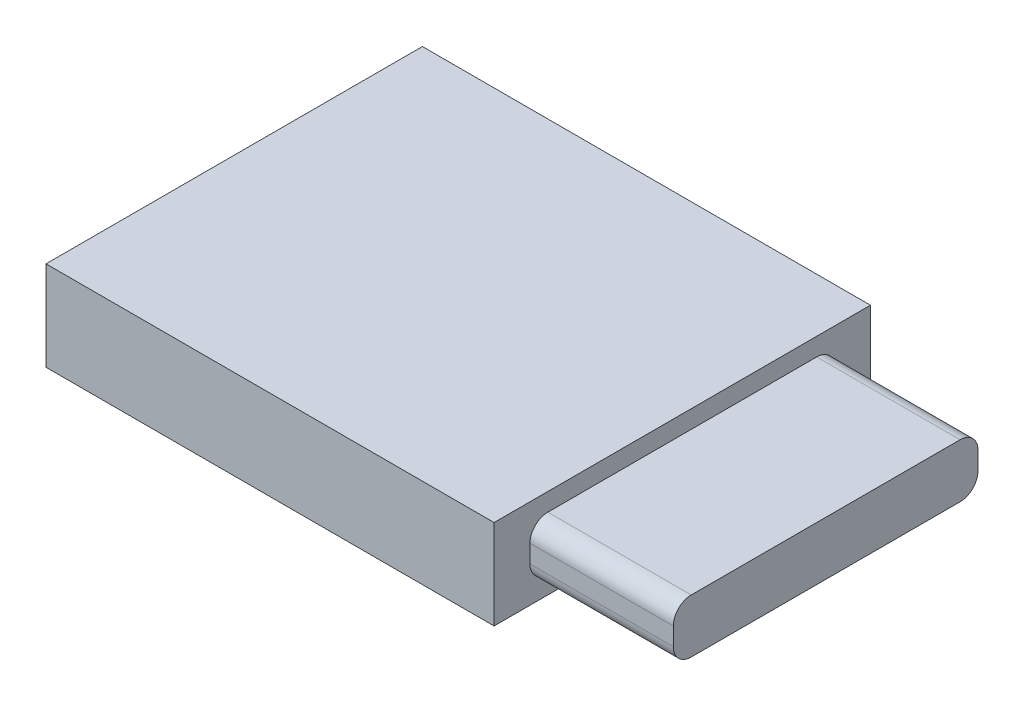
ISO-10303-21;
HEADER;
FILE_DESCRIPTION(('STEP AP214'),'2;1');
FILE_NAME('part.step','',(''),(''),'','','');
FILE_SCHEMA(('AUTOMOTIVE_DESIGN { 1 0 10303 214 1 1 1 1 }'));
ENDSEC;
DATA;
#1=APPLICATION_CONTEXT('core data for automotive mechanical design processes');
#2=APPLICATION_PROTOCOL_DEFINITION('international standard','automotive_design',2000,#1);
#3=PRODUCT_CONTEXT('',#1,'mechanical');
#4=PRODUCT('Part','Part','',(#3));
#5=PRODUCT_RELATED_PRODUCT_CATEGORY('part','',(#4));
#6=PRODUCT_DEFINITION_FORMATION('','',#4);
#7=PRODUCT_DEFINITION_CONTEXT('part definition',#1,'design');
#8=PRODUCT_DEFINITION('design','',#6,#7);
#9=PRODUCT_DEFINITION_SHAPE('','',#8);
#10=(LENGTH_UNIT() NAMED_UNIT(*) SI_UNIT(.MILLI.,.METRE.));
#11=(NAMED_UNIT(*) PLANE_ANGLE_UNIT() SI_UNIT($,.RADIAN.));
#12=(NAMED_UNIT(*) SI_UNIT($,.STERADIAN.) SOLID_ANGLE_UNIT());
#13=UNCERTAINTY_MEASURE_WITH_UNIT(LENGTH_MEASURE(1.E-05),#10,'distance_accuracy_value','');
#14=(GEOMETRIC_REPRESENTATION_CONTEXT(3) GLOBAL_UNCERTAINTY_ASSIGNED_CONTEXT((#13)) GLOBAL_UNIT_ASSIGNED_CONTEXT((#10,
#11,#12)) REPRESENTATION_CONTEXT('',''));
#15=CARTESIAN_POINT('',(0.,0.,0.));
#16=DIRECTION('',(0.,0.,1.));
#17=DIRECTION('',(1.,0.,0.));
#18=AXIS2_PLACEMENT_3D('',#15,#16,#17);
#19=CARTESIAN_POINT('',(12.5,5.,10.5));
#20=DIRECTION('',(-1.,0.,0.));
#21=DIRECTION('',(0.,0.,1.));
#22=AXIS2_PLACEMENT_3D('',#19,#20,#21);
#23=PLANE('',#22);
#24=DIRECTION('',(0.,0.,-1.));
#25=VECTOR('',#24,1.);
#26=CARTESIAN_POINT('',(12.5,0.,10.5));
#27=LINE('',#26,#25);
#28=CARTESIAN_POINT('',(12.5,0.,10.5));
#29=VERTEX_POINT('',#28);
#30=CARTESIAN_POINT('',(12.5,0.,-10.5));
#31=VERTEX_POINT('',#30);
#32=EDGE_CURVE('E143',#29,#31,#27,.T.);
#33=ORIENTED_EDGE('',*,*,#32,.T.);
#34=DIRECTION('',(0.,-1.,0.));
#35=VECTOR('',#34,1.);
#36=CARTESIAN_POINT('',(12.5,5.,-10.5));
#37=LINE('',#36,#35);
#38=CARTESIAN_POINT('',(12.5,5.,-10.5));
#39=VERTEX_POINT('',#38);
#40=EDGE_CURVE('E11',#39,#31,#37,.T.);
#41=ORIENTED_EDGE('',*,*,#40,.F.);
#42=DIRECTION('',(0.,0.,-1.));
#43=VECTOR('',#42,1.);
#44=CARTESIAN_POINT('',(12.5,5.,10.5));
#45=LINE('',#44,#43);
#46=CARTESIAN_POINT('',(12.5,5.,10.5));
#47=VERTEX_POINT('',#46);
#48=EDGE_CURVE('E230',#47,#39,#45,.T.);
#49=ORIENTED_EDGE('',*,*,#48,.F.);
#50=DIRECTION('',(0.,-1.,0.));
#51=VECTOR('',#50,1.);
#52=CARTESIAN_POINT('',(12.5,5.,10.5));
#53=LINE('',#52,#51);
#54=EDGE_CURVE('E244',#47,#29,#53,.T.);
#55=ORIENTED_EDGE('',*,*,#54,.T.);
#56=EDGE_LOOP('',(#33,#41,#49,#55));
#57=FACE_BOUND('',#56,.T.);
#58=CARTESIAN_POINT('',(12.5,3.,7.5));
#59=DIRECTION('',(1.,0.,0.));
#60=DIRECTION('',(0.,0.,-1.));
#61=AXIS2_PLACEMENT_3D('',#58,#59,#60);
#62=CIRCLE('',#61,1.);
#63=CARTESIAN_POINT('',(12.5,4.,7.49999999999999));
#64=VERTEX_POINT('',#63);
#65=CARTESIAN_POINT('',(12.5,2.99999999999999,8.5));
#66=VERTEX_POINT('',#65);
#67=EDGE_CURVE('E186',#64,#66,#62,.T.);
#68=ORIENTED_EDGE('',*,*,#67,.F.);
#69=DIRECTION('',(0.,0.,-1.));
#70=VECTOR('',#69,1.);
#71=CARTESIAN_POINT('',(12.5,4.,0.));
#72=LINE('',#71,#70);
#73=CARTESIAN_POINT('',(12.5,4.,-7.5));
#74=VERTEX_POINT('',#73);
#75=EDGE_CURVE('E62',#64,#74,#72,.T.);
#76=ORIENTED_EDGE('',*,*,#75,.T.);
#77=CARTESIAN_POINT('',(12.5,3.,-7.5));
#78=DIRECTION('',(1.,0.,0.));
#79=DIRECTION('',(0.,0.,-1.));
#80=AXIS2_PLACEMENT_3D('',#77,#78,#79);
#81=CIRCLE('',#80,1.);
#82=CARTESIAN_POINT('',(12.5,2.99999999999999,-8.5));
#83=VERTEX_POINT('',#82);
#84=EDGE_CURVE('E67',#83,#74,#81,.T.);
#85=ORIENTED_EDGE('',*,*,#84,.F.);
#86=DIRECTION('',(0.,-1.,0.));
#87=VECTOR('',#86,1.);
#88=CARTESIAN_POINT('',(12.5,0.,-8.5));
#89=LINE('',#88,#87);
#90=CARTESIAN_POINT('',(12.5,2.00000000000001,-8.5));
#91=VERTEX_POINT('',#90);
#92=EDGE_CURVE('E163',#83,#91,#89,.T.);
#93=ORIENTED_EDGE('',*,*,#92,.T.);
#94=CARTESIAN_POINT('',(12.5,2.,-7.5));
#95=DIRECTION('',(1.,0.,0.));
#96=DIRECTION('',(0.,0.,-1.));
#97=AXIS2_PLACEMENT_3D('',#94,#95,#96);
#98=CIRCLE('',#97,1.);
#99=CARTESIAN_POINT('',(12.5,1.,-7.5));
#100=VERTEX_POINT('',#99);
#101=EDGE_CURVE('E201',#100,#91,#98,.T.);
#102=ORIENTED_EDGE('',*,*,#101,.F.);
#103=DIRECTION('',(0.,0.,-1.));
#104=VECTOR('',#103,1.);
#105=CARTESIAN_POINT('',(12.5,1.,0.));
#106=LINE('',#105,#104);
#107=CARTESIAN_POINT('',(12.5,1.,7.49999999999999));
#108=VERTEX_POINT('',#107);
#109=EDGE_CURVE('E197',#108,#100,#106,.T.);
#110=ORIENTED_EDGE('',*,*,#109,.F.);
#111=CARTESIAN_POINT('',(12.5,2.,7.5));
#112=DIRECTION('',(1.,0.,0.));
#113=DIRECTION('',(0.,0.,-1.));
#114=AXIS2_PLACEMENT_3D('',#111,#112,#113);
#115=CIRCLE('',#114,1.);
#116=CARTESIAN_POINT('',(12.5,2.00000000000001,8.5));
#117=VERTEX_POINT('',#116);
#118=EDGE_CURVE('E193',#117,#108,#115,.T.);
#119=ORIENTED_EDGE('',*,*,#118,.F.);
#120=DIRECTION('',(0.,-1.,0.));
#121=VECTOR('',#120,1.);
#122=CARTESIAN_POINT('',(12.5,0.,8.5));
#123=LINE('',#122,#121);
#124=EDGE_CURVE('E189',#66,#117,#123,.T.);
#125=ORIENTED_EDGE('',*,*,#124,.F.);
#126=EDGE_LOOP('',(#68,#76,#85,#93,#102,#110,#119,#125));
#127=FACE_BOUND('',#126,.T.);
#128=ADVANCED_FACE('F47',(#57,#127),#23,.F.);
#129=CARTESIAN_POINT('',(-12.5,5.,-10.5));
#130=DIRECTION('',(0.,0.,1.));
#131=DIRECTION('',(1.,0.,0.));
#132=AXIS2_PLACEMENT_3D('',#129,#130,#131);
#133=PLANE('',#132);
#134=DIRECTION('',(-1.,0.,0.));
#135=VECTOR('',#134,1.);
#136=CARTESIAN_POINT('',(-12.5,0.,-10.5));
#137=LINE('',#136,#135);
#138=CARTESIAN_POINT('',(-12.5,0.,-10.5));
#139=VERTEX_POINT('',#138);
#140=EDGE_CURVE('E248',#31,#139,#137,.T.);
#141=ORIENTED_EDGE('',*,*,#140,.T.);
#142=DIRECTION('',(0.,-1.,0.));
#143=VECTOR('',#142,1.);
#144=CARTESIAN_POINT('',(-12.5,5.,-10.5));
#145=LINE('',#144,#143);
#146=CARTESIAN_POINT('',(-12.5,5.,-10.5));
#147=VERTEX_POINT('',#146);
#148=EDGE_CURVE('E55',#147,#139,#145,.T.);
#149=ORIENTED_EDGE('',*,*,#148,.F.);
#150=DIRECTION('',(-1.,0.,0.));
#151=VECTOR('',#150,1.);
#152=CARTESIAN_POINT('',(-12.5,5.,-10.5));
#153=LINE('',#152,#151);
#154=EDGE_CURVE('E234',#39,#147,#153,.T.);
#155=ORIENTED_EDGE('',*,*,#154,.F.);
#156=ORIENTED_EDGE('',*,*,#40,.T.);
#157=EDGE_LOOP('',(#141,#149,#155,#156));
#158=FACE_BOUND('',#157,.T.);
#159=ADVANCED_FACE('F284',(#158),#133,.F.);
#160=CARTESIAN_POINT('',(-12.5,5.,10.5));
#161=DIRECTION('',(1.,0.,0.));
#162=DIRECTION('',(0.,0.,-1.));
#163=AXIS2_PLACEMENT_3D('',#160,#161,#162);
#164=PLANE('',#163);
#165=DIRECTION('',(0.,0.,1.));
#166=VECTOR('',#165,1.);
#167=CARTESIAN_POINT('',(-12.5,0.,10.5));
#168=LINE('',#167,#166);
#169=CARTESIAN_POINT('',(-12.5,0.,10.5));
#170=VERTEX_POINT('',#169);
#171=EDGE_CURVE('E251',#139,#170,#168,.T.);
#172=ORIENTED_EDGE('',*,*,#171,.T.);
#173=DIRECTION('',(0.,-1.,0.));
#174=VECTOR('',#173,1.);
#175=CARTESIAN_POINT('',(-12.5,5.,10.5));
#176=LINE('',#175,#174);
#177=CARTESIAN_POINT('',(-12.5,5.,10.5));
#178=VERTEX_POINT('',#177);
#179=EDGE_CURVE('E259',#178,#170,#176,.T.);
#180=ORIENTED_EDGE('',*,*,#179,.F.);
#181=DIRECTION('',(0.,0.,1.));
#182=VECTOR('',#181,1.);
#183=CARTESIAN_POINT('',(-12.5,5.,10.5));
#184=LINE('',#183,#182);
#185=EDGE_CURVE('E238',#147,#178,#184,.T.);
#186=ORIENTED_EDGE('',*,*,#185,.F.);
#187=ORIENTED_EDGE('',*,*,#148,.T.);
#188=EDGE_LOOP('',(#172,#180,#186,#187));
#189=FACE_BOUND('',#188,.T.);
#190=ADVANCED_FACE('F268',(#189),#164,.F.);
#191=CARTESIAN_POINT('',(-12.5,5.,10.5));
#192=DIRECTION('',(0.,0.,-1.));
#193=DIRECTION('',(-1.,0.,0.));
#194=AXIS2_PLACEMENT_3D('',#191,#192,#193);
#195=PLANE('',#194);
#196=DIRECTION('',(1.,0.,0.));
#197=VECTOR('',#196,1.);
#198=CARTESIAN_POINT('',(-12.5,0.,10.5));
#199=LINE('',#198,#197);
#200=EDGE_CURVE('E235',#170,#29,#199,.T.);
#201=ORIENTED_EDGE('',*,*,#200,.T.);
#202=ORIENTED_EDGE('',*,*,#54,.F.);
#203=DIRECTION('',(1.,0.,0.));
#204=VECTOR('',#203,1.);
#205=CARTESIAN_POINT('',(-12.5,5.,10.5));
#206=LINE('',#205,#204);
#207=EDGE_CURVE('E241',#178,#47,#206,.T.);
#208=ORIENTED_EDGE('',*,*,#207,.F.);
#209=ORIENTED_EDGE('',*,*,#179,.T.);
#210=EDGE_LOOP('',(#201,#202,#208,#209));
#211=FACE_BOUND('',#210,.T.);
#212=ADVANCED_FACE('F277',(#211),#195,.F.);
#213=CARTESIAN_POINT('',(0.,5.,0.));
#214=DIRECTION('',(0.,-1.,0.));
#215=DIRECTION('',(0.,0.,-1.));
#216=AXIS2_PLACEMENT_3D('',#213,#214,#215);
#217=PLANE('',#216);
#218=ORIENTED_EDGE('',*,*,#48,.T.);
#219=ORIENTED_EDGE('',*,*,#154,.T.);
#220=ORIENTED_EDGE('',*,*,#185,.T.);
#221=ORIENTED_EDGE('',*,*,#207,.T.);
#222=EDGE_LOOP('',(#218,#219,#220,#221));
#223=FACE_BOUND('',#222,.T.);
#224=ADVANCED_FACE('F283',(#223),#217,.F.);
#225=CARTESIAN_POINT('',(0.,0.,0.));
#226=DIRECTION('',(0.,-1.,0.));
#227=DIRECTION('',(0.,0.,-1.));
#228=AXIS2_PLACEMENT_3D('',#225,#226,#227);
#229=PLANE('',#228);
#230=ORIENTED_EDGE('',*,*,#32,.F.);
#231=ORIENTED_EDGE('',*,*,#200,.F.);
#232=ORIENTED_EDGE('',*,*,#171,.F.);
#233=ORIENTED_EDGE('',*,*,#140,.F.);
#234=EDGE_LOOP('',(#230,#231,#232,#233));
#235=FACE_BOUND('',#234,.T.);
#236=ADVANCED_FACE('F274',(#235),#229,.T.);
#237=CARTESIAN_POINT('',(20.5,4.,0.));
#238=DIRECTION('',(0.,1.,0.));
#239=DIRECTION('',(0.,0.,1.));
#240=AXIS2_PLACEMENT_3D('',#237,#238,#239);
#241=PLANE('',#240);
#242=ORIENTED_EDGE('',*,*,#75,.F.);
#243=DIRECTION('',(-1.,0.,0.));
#244=VECTOR('',#243,1.);
#245=CARTESIAN_POINT('',(20.5,4.,7.49999999999999));
#246=LINE('',#245,#244);
#247=CARTESIAN_POINT('',(20.5,4.,7.49999999999999));
#248=VERTEX_POINT('',#247);
#249=EDGE_CURVE('E135',#248,#64,#246,.T.);
#250=ORIENTED_EDGE('',*,*,#249,.F.);
#251=DIRECTION('',(0.,0.,-1.));
#252=VECTOR('',#251,1.);
#253=CARTESIAN_POINT('',(20.5,4.,0.));
#254=LINE('',#253,#252);
#255=CARTESIAN_POINT('',(20.5,4.,-7.5));
#256=VERTEX_POINT('',#255);
#257=EDGE_CURVE('E139',#248,#256,#254,.T.);
#258=ORIENTED_EDGE('',*,*,#257,.T.);
#259=DIRECTION('',(-1.,0.,0.));
#260=VECTOR('',#259,1.);
#261=CARTESIAN_POINT('',(20.5,4.,-7.5));
#262=LINE('',#261,#260);
#263=EDGE_CURVE('E183',#256,#74,#262,.T.);
#264=ORIENTED_EDGE('',*,*,#263,.T.);
#265=EDGE_LOOP('',(#242,#250,#258,#264));
#266=FACE_BOUND('',#265,.T.);
#267=ADVANCED_FACE('F137',(#266),#241,.T.);
#268=CARTESIAN_POINT('',(20.5,3.,7.5));
#269=DIRECTION('',(-1.,0.,0.));
#270=DIRECTION('',(0.,0.,1.));
#271=AXIS2_PLACEMENT_3D('',#268,#269,#270);
#272=CYLINDRICAL_SURFACE('',#271,1.);
#273=ORIENTED_EDGE('',*,*,#67,.T.);
#274=DIRECTION('',(-1.,0.,0.));
#275=VECTOR('',#274,1.);
#276=CARTESIAN_POINT('',(20.5,2.99999999999999,8.5));
#277=LINE('',#276,#275);
#278=CARTESIAN_POINT('',(20.5,2.99999999999999,8.5));
#279=VERTEX_POINT('',#278);
#280=EDGE_CURVE('E144',#279,#66,#277,.T.);
#281=ORIENTED_EDGE('',*,*,#280,.F.);
#282=CARTESIAN_POINT('',(20.5,3.,7.5));
#283=DIRECTION('',(1.,0.,0.));
#284=DIRECTION('',(0.,0.,-1.));
#285=AXIS2_PLACEMENT_3D('',#282,#283,#284);
#286=CIRCLE('',#285,1.);
#287=EDGE_CURVE('E147',#248,#279,#286,.T.);
#288=ORIENTED_EDGE('',*,*,#287,.F.);
#289=ORIENTED_EDGE('',*,*,#249,.T.);
#290=EDGE_LOOP('',(#273,#281,#288,#289));
#291=FACE_BOUND('',#290,.T.);
#292=ADVANCED_FACE('F148',(#291),#272,.T.);
#293=CARTESIAN_POINT('',(20.5,0.,8.5));
#294=DIRECTION('',(0.,0.,-1.));
#295=DIRECTION('',(-1.,0.,0.));
#296=AXIS2_PLACEMENT_3D('',#293,#294,#295);
#297=PLANE('',#296);
#298=ORIENTED_EDGE('',*,*,#124,.T.);
#299=DIRECTION('',(-1.,0.,0.));
#300=VECTOR('',#299,1.);
#301=CARTESIAN_POINT('',(20.5,2.00000000000001,8.5));
#302=LINE('',#301,#300);
#303=CARTESIAN_POINT('',(20.5,2.00000000000001,8.5));
#304=VERTEX_POINT('',#303);
#305=EDGE_CURVE('E224',#304,#117,#302,.T.);
#306=ORIENTED_EDGE('',*,*,#305,.F.);
#307=DIRECTION('',(0.,-1.,0.));
#308=VECTOR('',#307,1.);
#309=CARTESIAN_POINT('',(20.5,0.,8.5));
#310=LINE('',#309,#308);
#311=EDGE_CURVE('E153',#279,#304,#310,.T.);
#312=ORIENTED_EDGE('',*,*,#311,.F.);
#313=ORIENTED_EDGE('',*,*,#280,.T.);
#314=EDGE_LOOP('',(#298,#306,#312,#313));
#315=FACE_BOUND('',#314,.T.);
#316=ADVANCED_FACE('F302',(#315),#297,.F.);
#317=CARTESIAN_POINT('',(20.5,2.,7.5));
#318=DIRECTION('',(-1.,0.,0.));
#319=DIRECTION('',(0.,0.,1.));
#320=AXIS2_PLACEMENT_3D('',#317,#318,#319);
#321=CYLINDRICAL_SURFACE('',#320,1.);
#322=ORIENTED_EDGE('',*,*,#118,.T.);
#323=DIRECTION('',(-1.,0.,0.));
#324=VECTOR('',#323,1.);
#325=CARTESIAN_POINT('',(20.5,1.,7.49999999999999));
#326=LINE('',#325,#324);
#327=CARTESIAN_POINT('',(20.5,1.,7.49999999999999));
#328=VERTEX_POINT('',#327);
#329=EDGE_CURVE('E220',#328,#108,#326,.T.);
#330=ORIENTED_EDGE('',*,*,#329,.F.);
#331=CARTESIAN_POINT('',(20.5,2.,7.5));
#332=DIRECTION('',(1.,0.,0.));
#333=DIRECTION('',(0.,0.,-1.));
#334=AXIS2_PLACEMENT_3D('',#331,#332,#333);
#335=CIRCLE('',#334,1.);
#336=EDGE_CURVE('E168',#304,#328,#335,.T.);
#337=ORIENTED_EDGE('',*,*,#336,.F.);
#338=ORIENTED_EDGE('',*,*,#305,.T.);
#339=EDGE_LOOP('',(#322,#330,#337,#338));
#340=FACE_BOUND('',#339,.T.);
#341=ADVANCED_FACE('F305',(#340),#321,.T.);
#342=CARTESIAN_POINT('',(20.5,1.,0.));
#343=DIRECTION('',(0.,1.,0.));
#344=DIRECTION('',(0.,0.,1.));
#345=AXIS2_PLACEMENT_3D('',#342,#343,#344);
#346=PLANE('',#345);
#347=ORIENTED_EDGE('',*,*,#109,.T.);
#348=DIRECTION('',(-1.,0.,0.));
#349=VECTOR('',#348,1.);
#350=CARTESIAN_POINT('',(20.5,1.,-7.5));
#351=LINE('',#350,#349);
#352=CARTESIAN_POINT('',(20.5,1.,-7.5));
#353=VERTEX_POINT('',#352);
#354=EDGE_CURVE('E216',#353,#100,#351,.T.);
#355=ORIENTED_EDGE('',*,*,#354,.F.);
#356=DIRECTION('',(0.,0.,-1.));
#357=VECTOR('',#356,1.);
#358=CARTESIAN_POINT('',(20.5,1.,0.));
#359=LINE('',#358,#357);
#360=EDGE_CURVE('E171',#328,#353,#359,.T.);
#361=ORIENTED_EDGE('',*,*,#360,.F.);
#362=ORIENTED_EDGE('',*,*,#329,.T.);
#363=EDGE_LOOP('',(#347,#355,#361,#362));
#364=FACE_BOUND('',#363,.T.);
#365=ADVANCED_FACE('F309',(#364),#346,.F.);
#366=CARTESIAN_POINT('',(20.5,2.,-7.5));
#367=DIRECTION('',(-1.,0.,0.));
#368=DIRECTION('',(0.,0.,1.));
#369=AXIS2_PLACEMENT_3D('',#366,#367,#368);
#370=CYLINDRICAL_SURFACE('',#369,1.);
#371=ORIENTED_EDGE('',*,*,#101,.T.);
#372=DIRECTION('',(-1.,0.,0.));
#373=VECTOR('',#372,1.);
#374=CARTESIAN_POINT('',(20.5,2.00000000000001,-8.5));
#375=LINE('',#374,#373);
#376=CARTESIAN_POINT('',(20.5,2.00000000000001,-8.5));
#377=VERTEX_POINT('',#376);
#378=EDGE_CURVE('E212',#377,#91,#375,.T.);
#379=ORIENTED_EDGE('',*,*,#378,.F.);
#380=CARTESIAN_POINT('',(20.5,2.,-7.5));
#381=DIRECTION('',(1.,0.,0.));
#382=DIRECTION('',(0.,0.,-1.));
#383=AXIS2_PLACEMENT_3D('',#380,#381,#382);
#384=CIRCLE('',#383,1.);
#385=EDGE_CURVE('E174',#353,#377,#384,.T.);
#386=ORIENTED_EDGE('',*,*,#385,.F.);
#387=ORIENTED_EDGE('',*,*,#354,.T.);
#388=EDGE_LOOP('',(#371,#379,#386,#387));
#389=FACE_BOUND('',#388,.T.);
#390=ADVANCED_FACE('F313',(#389),#370,.T.);
#391=CARTESIAN_POINT('',(20.5,0.,-8.5));
#392=DIRECTION('',(0.,0.,-1.));
#393=DIRECTION('',(-1.,0.,0.));
#394=AXIS2_PLACEMENT_3D('',#391,#392,#393);
#395=PLANE('',#394);
#396=ORIENTED_EDGE('',*,*,#92,.F.);
#397=DIRECTION('',(-1.,0.,0.));
#398=VECTOR('',#397,1.);
#399=CARTESIAN_POINT('',(20.5,2.99999999999999,-8.5));
#400=LINE('',#399,#398);
#401=CARTESIAN_POINT('',(20.5,2.99999999999999,-8.5));
#402=VERTEX_POINT('',#401);
#403=EDGE_CURVE('E209',#402,#83,#400,.T.);
#404=ORIENTED_EDGE('',*,*,#403,.F.);
#405=DIRECTION('',(0.,-1.,0.));
#406=VECTOR('',#405,1.);
#407=CARTESIAN_POINT('',(20.5,0.,-8.5));
#408=LINE('',#407,#406);
#409=EDGE_CURVE('E177',#402,#377,#408,.T.);
#410=ORIENTED_EDGE('',*,*,#409,.T.);
#411=ORIENTED_EDGE('',*,*,#378,.T.);
#412=EDGE_LOOP('',(#396,#404,#410,#411));
#413=FACE_BOUND('',#412,.T.);
#414=ADVANCED_FACE('F317',(#413),#395,.T.);
#415=CARTESIAN_POINT('',(20.5,3.,-7.5));
#416=DIRECTION('',(-1.,0.,0.));
#417=DIRECTION('',(0.,0.,1.));
#418=AXIS2_PLACEMENT_3D('',#415,#416,#417);
#419=CYLINDRICAL_SURFACE('',#418,1.);
#420=ORIENTED_EDGE('',*,*,#84,.T.);
#421=ORIENTED_EDGE('',*,*,#263,.F.);
#422=CARTESIAN_POINT('',(20.5,3.,-7.5));
#423=DIRECTION('',(1.,0.,0.));
#424=DIRECTION('',(0.,0.,-1.));
#425=AXIS2_PLACEMENT_3D('',#422,#423,#424);
#426=CIRCLE('',#425,1.);
#427=EDGE_CURVE('E158',#402,#256,#426,.T.);
#428=ORIENTED_EDGE('',*,*,#427,.F.);
#429=ORIENTED_EDGE('',*,*,#403,.T.);
#430=EDGE_LOOP('',(#420,#421,#428,#429));
#431=FACE_BOUND('',#430,.T.);
#432=ADVANCED_FACE('F321',(#431),#419,.T.);
#433=CARTESIAN_POINT('',(20.5,0.,0.));
#434=DIRECTION('',(1.,0.,0.));
#435=DIRECTION('',(0.,0.,-1.));
#436=AXIS2_PLACEMENT_3D('',#433,#434,#435);
#437=PLANE('',#436);
#438=ORIENTED_EDGE('',*,*,#257,.F.);
#439=ORIENTED_EDGE('',*,*,#287,.T.);
#440=ORIENTED_EDGE('',*,*,#311,.T.);
#441=ORIENTED_EDGE('',*,*,#336,.T.);
#442=ORIENTED_EDGE('',*,*,#360,.T.);
#443=ORIENTED_EDGE('',*,*,#385,.T.);
#444=ORIENTED_EDGE('',*,*,#409,.F.);
#445=ORIENTED_EDGE('',*,*,#427,.T.);
#446=EDGE_LOOP('',(#438,#439,#440,#441,#442,#443,#444,#445));
#447=FACE_BOUND('',#446,.T.);
#448=ADVANCED_FACE('F155',(#447),#437,.T.);
#449=CLOSED_SHELL('',(#128,#159,#190,#212,#224,#236,#267,#292,#316,#341,#365,#390,#414,#432,#448));
#450=MANIFOLD_SOLID_BREP('B2',#449);
#451=ADVANCED_BREP_SHAPE_REPRESENTATION('',(#18,#450),#14);
#452=SHAPE_DEFINITION_REPRESENTATION(#9,#451);
ENDSEC;
END-ISO-10303-21;
